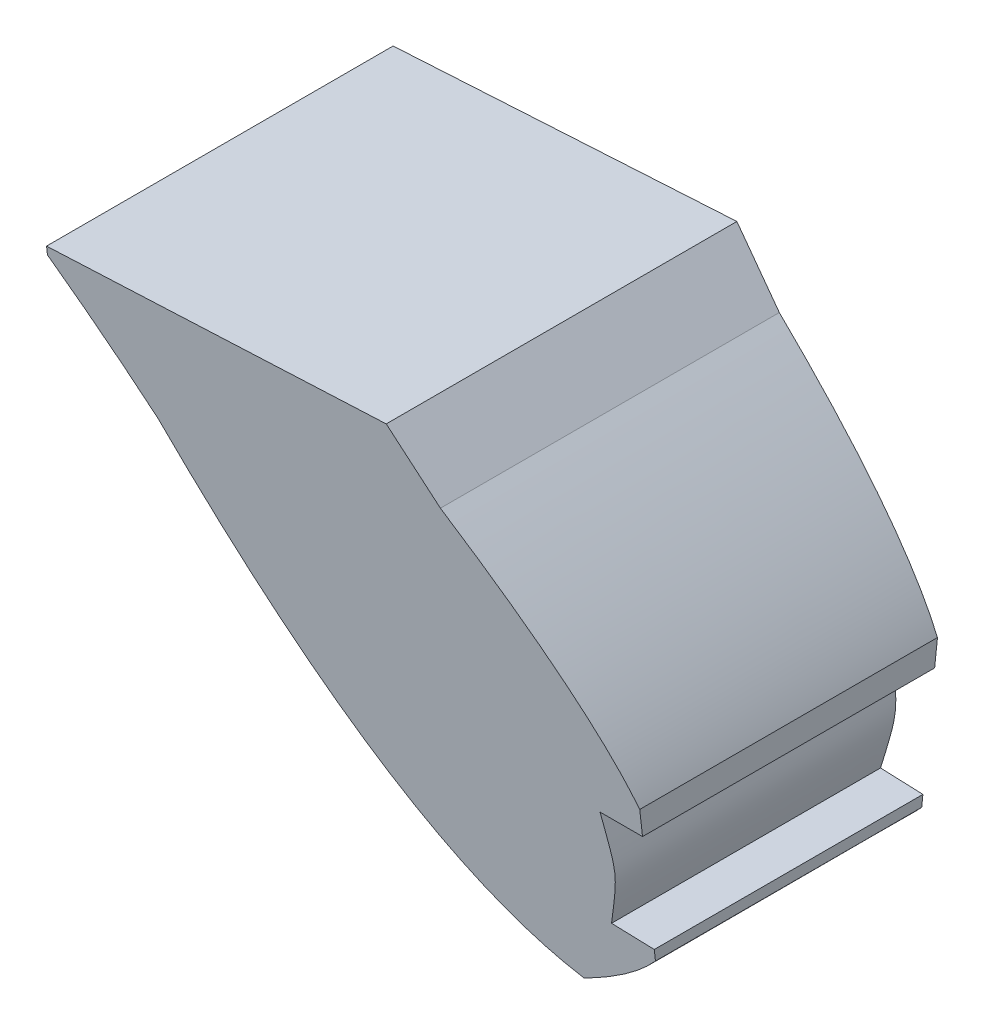
ISO-10303-21;
HEADER;
FILE_DESCRIPTION(('STEP AP214'),'2;1');
FILE_NAME('part.step','',(''),(''),'','','');
FILE_SCHEMA(('AUTOMOTIVE_DESIGN { 1 0 10303 214 1 1 1 1 }'));
ENDSEC;
DATA;
#1=APPLICATION_CONTEXT('core data for automotive mechanical design processes');
#2=APPLICATION_PROTOCOL_DEFINITION('international standard','automotive_design',2000,#1);
#3=PRODUCT_CONTEXT('',#1,'mechanical');
#4=PRODUCT('Part','Part','',(#3));
#5=PRODUCT_RELATED_PRODUCT_CATEGORY('part','',(#4));
#6=PRODUCT_DEFINITION_FORMATION('','',#4);
#7=PRODUCT_DEFINITION_CONTEXT('part definition',#1,'design');
#8=PRODUCT_DEFINITION('design','',#6,#7);
#9=PRODUCT_DEFINITION_SHAPE('','',#8);
#10=(LENGTH_UNIT() NAMED_UNIT(*) SI_UNIT(.MILLI.,.METRE.));
#11=(NAMED_UNIT(*) PLANE_ANGLE_UNIT() SI_UNIT($,.RADIAN.));
#12=(NAMED_UNIT(*) SI_UNIT($,.STERADIAN.) SOLID_ANGLE_UNIT());
#13=UNCERTAINTY_MEASURE_WITH_UNIT(LENGTH_MEASURE(1.E-05),#10,'distance_accuracy_value','');
#14=(GEOMETRIC_REPRESENTATION_CONTEXT(3) GLOBAL_UNCERTAINTY_ASSIGNED_CONTEXT((#13)) GLOBAL_UNIT_ASSIGNED_CONTEXT((#10,
#11,#12)) REPRESENTATION_CONTEXT('',''));
#15=CARTESIAN_POINT('',(0.,0.,0.));
#16=DIRECTION('',(0.,0.,1.));
#17=DIRECTION('',(1.,0.,0.));
#18=AXIS2_PLACEMENT_3D('',#15,#16,#17);
#19=CARTESIAN_POINT('',(0.355125000055651,-1.23774703808888E-13,7.21));
#20=DIRECTION('',(-1.,3.48538412642003E-13,0.));
#21=DIRECTION('',(-3.48538412642003E-13,-1.,0.));
#22=AXIS2_PLACEMENT_3D('',#19,#20,#21);
#23=PLANE('',#22);
#24=DIRECTION('',(0.,-0.993653373689782,0.112485434412263));
#25=VECTOR('',#24,1.);
#26=CARTESIAN_POINT('',(0.355125000056697,12.6081551722012,-7.21));
#27=LINE('',#26,#25);
#28=CARTESIAN_POINT('',(0.355125000056697,3.0015495286345,-6.12249480185305));
#29=VERTEX_POINT('',#28);
#30=CARTESIAN_POINT('',(0.355125000056447,1.97626956518499,-6.00642911422341));
#31=VERTEX_POINT('',#30);
#32=EDGE_CURVE('E58',#29,#31,#27,.T.);
#33=ORIENTED_EDGE('',*,*,#32,.F.);
#34=DIRECTION('',(0.,0.,-1.));
#35=VECTOR('',#34,1.);
#36=CARTESIAN_POINT('',(0.355125000056697,3.0015495286345,7.21));
#37=LINE('',#36,#35);
#38=CARTESIAN_POINT('',(0.355125000056697,3.0015495286345,6.12249480185305));
#39=VERTEX_POINT('',#38);
#40=EDGE_CURVE('E177',#39,#29,#37,.T.);
#41=ORIENTED_EDGE('',*,*,#40,.F.);
#42=DIRECTION('',(0.,0.993653373689782,0.112485434412263));
#43=VECTOR('',#42,1.);
#44=CARTESIAN_POINT('',(0.355125000056697,12.6081551722012,7.21));
#45=LINE('',#44,#43);
#46=CARTESIAN_POINT('',(0.355125000056697,1.97626956518499,6.00642911422342));
#47=VERTEX_POINT('',#46);
#48=EDGE_CURVE('E151',#47,#39,#45,.T.);
#49=ORIENTED_EDGE('',*,*,#48,.F.);
#50=DIRECTION('',(0.,0.,-1.));
#51=VECTOR('',#50,1.);
#52=CARTESIAN_POINT('',(0.355125000056447,1.97626956518499,7.21));
#53=LINE('',#52,#51);
#54=EDGE_CURVE('E171',#47,#31,#53,.T.);
#55=ORIENTED_EDGE('',*,*,#54,.T.);
#56=EDGE_LOOP('',(#33,#41,#49,#55));
#57=FACE_BOUND('',#56,.T.);
#58=ADVANCED_FACE('F43',(#57),#23,.F.);
#59=CARTESIAN_POINT('',(-23.0359211456035,0.,7.21));
#60=DIRECTION('',(-1.,0.,0.));
#61=DIRECTION('',(0.,0.,1.));
#62=AXIS2_PLACEMENT_3D('',#59,#60,#61);
#63=PLANE('',#62);
#64=DIRECTION('',(0.,0.,-1.));
#65=VECTOR('',#64,1.);
#66=CARTESIAN_POINT('',(-23.0359211456035,11.8716122879342,7.21));
#67=LINE('',#66,#65);
#68=CARTESIAN_POINT('',(-23.0359211456035,11.8716122879342,7.12662047501294));
#69=VERTEX_POINT('',#68);
#70=CARTESIAN_POINT('',(-23.0359211456035,11.8716122879342,-7.12662047501294));
#71=VERTEX_POINT('',#70);
#72=EDGE_CURVE('E188',#69,#71,#67,.T.);
#73=ORIENTED_EDGE('',*,*,#72,.T.);
#74=DIRECTION('',(0.,-0.993653373689782,0.112485434412263));
#75=VECTOR('',#74,1.);
#76=CARTESIAN_POINT('',(-23.0359211456035,12.6081551722012,-7.21));
#77=LINE('',#76,#75);
#78=CARTESIAN_POINT('',(-23.0359211456035,11.5401378200982,-7.08909627341673));
#79=VERTEX_POINT('',#78);
#80=EDGE_CURVE('E324',#71,#79,#77,.T.);
#81=ORIENTED_EDGE('',*,*,#80,.T.);
#82=DIRECTION('',(0.,0.,-1.));
#83=VECTOR('',#82,1.);
#84=CARTESIAN_POINT('',(-23.0359211456035,11.5401378200983,7.21));
#85=LINE('',#84,#83);
#86=CARTESIAN_POINT('',(-23.0359211456035,11.5401378200982,7.08909627341673));
#87=VERTEX_POINT('',#86);
#88=EDGE_CURVE('E195',#87,#79,#85,.T.);
#89=ORIENTED_EDGE('',*,*,#88,.F.);
#90=DIRECTION('',(0.,0.993653373689782,0.112485434412263));
#91=VECTOR('',#90,1.);
#92=CARTESIAN_POINT('',(-23.0359211456035,12.6081551722012,7.21));
#93=LINE('',#92,#91);
#94=EDGE_CURVE('E316',#87,#69,#93,.T.);
#95=ORIENTED_EDGE('',*,*,#94,.T.);
#96=EDGE_LOOP('',(#73,#81,#89,#95));
#97=FACE_BOUND('',#96,.T.);
#98=ADVANCED_FACE('F319',(#97),#63,.T.);
#99=CARTESIAN_POINT('',(-18.9451921135982,7.54091889574655,7.21));
#100=CARTESIAN_POINT('',(-10.2150083842792,-3.69764410322756,7.21));
#101=CARTESIAN_POINT('',(-2.84660482498738,-5.05908110388432,7.21));
#102=(BOUNDED_CURVE() B_SPLINE_CURVE(2,(#99,#100,#101),.UNSPECIFIED.,.F.,
.F.) B_SPLINE_CURVE_WITH_KNOTS((3,3),(0.497667241108509,0.499554279588011),
.UNSPECIFIED.) CURVE() GEOMETRIC_REPRESENTATION_ITEM() RATIONAL_B_SPLINE_CURVE((1.,1.,1.)) REPRESENTATION_ITEM(''));
#103=DIRECTION('',(0.,0.,-1.));
#104=VECTOR('',#103,1.);
#105=SURFACE_OF_LINEAR_EXTRUSION('',#102,#104);
#106=DIRECTION('',(0.,0.,-1.));
#107=VECTOR('',#106,1.);
#108=CARTESIAN_POINT('',(-18.9451921135982,7.54091889574657,7.21));
#109=LINE('',#108,#107);
#110=CARTESIAN_POINT('',(-18.9451921135982,7.54091889574657,6.63636910524442));
#111=VERTEX_POINT('',#110);
#112=CARTESIAN_POINT('',(-18.9451921135982,7.54091889574657,-6.63636910524442));
#113=VERTEX_POINT('',#112);
#114=EDGE_CURVE('E198',#111,#113,#109,.T.);
#115=ORIENTED_EDGE('',*,*,#114,.T.);
#116=CARTESIAN_POINT('',(-18.9451921135982,7.54091889574655,-6.63636910524441));
#117=CARTESIAN_POINT('',(-18.7033608655423,7.22962108931645,-6.60112898035273));
#118=CARTESIAN_POINT('',(-18.4592647140916,6.9200497206851,-6.56608429494821));
#119=CARTESIAN_POINT('',(-17.9661198805234,6.30464603742845,-6.49641819962467));
#120=CARTESIAN_POINT('',(-17.7170694462669,5.99881510969872,-6.46179694670763));
#121=CARTESIAN_POINT('',(-17.2137366178937,5.3913665824337,-6.39303140604553));
#122=CARTESIAN_POINT('',(-16.9594535947769,5.08974949683998,-6.35888717648066));
#123=CARTESIAN_POINT('',(-16.4451285665965,4.49103725761873,-6.29111061767257));
#124=CARTESIAN_POINT('',(-16.1850826962375,4.19394537928884,-6.25747865920581));
#125=CARTESIAN_POINT('',(-15.6590118901181,3.60508061675355,-6.1908168731366));
#126=CARTESIAN_POINT('',(-15.3929875534481,3.31330720485499,-6.15778698579723));
#127=CARTESIAN_POINT('',(-14.8544901847056,2.7357195544677,-6.09240181277284));
#128=CARTESIAN_POINT('',(-14.5820174931064,2.44990500284308,-6.06004649163962));
#129=CARTESIAN_POINT('',(-13.9777704357619,1.83142011947111,-5.99003159245484));
#130=CARTESIAN_POINT('',(-13.6445482479649,1.50014167377654,-5.95252958132897));
#131=CARTESIAN_POINT('',(-12.9673134934436,0.848664446736888,-5.87877982026175));
#132=CARTESIAN_POINT('',(-12.623301443116,0.528465136688492,-5.84253201046914));
#133=CARTESIAN_POINT('',(-11.9227759490938,-0.0995013958587514,-5.7714437516454));
#134=CARTESIAN_POINT('',(-11.5662405708663,-0.407244542107335,-5.73660602813964));
#135=CARTESIAN_POINT('',(-10.840142749037,-1.00720368374379,-5.66868831511867));
#136=CARTESIAN_POINT('',(-10.4705807273197,-1.29942018121482,-5.6356082687657));
#137=CARTESIAN_POINT('',(-9.71382699072171,-1.86779135556405,-5.57126643674768));
#138=CARTESIAN_POINT('',(-9.32650636654571,-2.14377746328672,-5.540023733768));
#139=CARTESIAN_POINT('',(-8.5360986768139,-2.67282289543975,-5.48013372902864));
#140=CARTESIAN_POINT('',(-8.13300835344273,-2.92587744631612,-5.45148696765387));
#141=CARTESIAN_POINT('',(-7.31201826568453,-3.40280761684766,-5.39749661363601));
#142=CARTESIAN_POINT('',(-6.89419365451789,-3.62680992502778,-5.37213867935817));
#143=CARTESIAN_POINT('',(-6.04187322097519,-4.0405536088069,-5.32530128189388));
#144=CARTESIAN_POINT('',(-5.60738935372736,-4.23031901573022,-5.30381909826786));
#145=CARTESIAN_POINT('',(-4.78985442909107,-4.54236533838515,-5.26849423842238));
#146=CARTESIAN_POINT('',(-4.4091055725695,-4.67052923075731,-5.25398558631979));
#147=CARTESIAN_POINT('',(-3.82960691198316,-4.83674345690554,-5.23516948814227));
#148=CARTESIAN_POINT('',(-3.63462104960687,-4.8878904691115,-5.22937944702812));
#149=CARTESIAN_POINT('',(-3.24229120544362,-4.9807402777546,-5.21886848683127));
#150=CARTESIAN_POINT('',(-3.0449461414238,-5.02243854990591,-5.21414807991536));
#151=CARTESIAN_POINT('',(-2.84660482498738,-5.05908110388432,-5.21));
#152=B_SPLINE_CURVE_WITH_KNOTS('',3,(#116,#117,#118,#119,#120,#121,#122,#123,#124,#125,#126,
#127,#128,#129,#130,#131,#132,#133,#134,#135,#136,#137,#138,#139,#140,#141,#142,#143,#144,#145,
#146,#147,#148,#149,#150,#151),.UNSPECIFIED.,.F.,.F.,(4,2,2,2,2,2,2,2,2,2,2,2,2,2,2,2,2,4),(0.,
1.1872997216569,2.37502708567824,3.56289806807204,4.75159146291787,5.9401662676152,
7.12867845491363,8.54255640265696,9.95636678593971,11.3727907462706,12.7891688759803,
14.2183172044781,15.6477623519031,17.0707480146133,18.4927309460623,19.6971402338765,
20.3019233237111,20.9069953892921),.UNSPECIFIED.);
#153=CARTESIAN_POINT('',(-2.84660482498738,-5.05908110388432,-5.21));
#154=VERTEX_POINT('',#153);
#155=EDGE_CURVE('E259',#113,#154,#152,.T.);
#156=ORIENTED_EDGE('',*,*,#155,.T.);
#157=DIRECTION('',(0.,0.,-1.));
#158=VECTOR('',#157,1.);
#159=CARTESIAN_POINT('',(-2.84660482498738,-5.05908110388432,7.21));
#160=LINE('',#159,#158);
#161=CARTESIAN_POINT('',(-2.84660482498738,-5.05908110388432,5.21));
#162=VERTEX_POINT('',#161);
#163=EDGE_CURVE('E160',#162,#154,#160,.T.);
#164=ORIENTED_EDGE('',*,*,#163,.F.);
#165=CARTESIAN_POINT('',(-2.84660482498738,-5.05908110388432,5.21));
#166=CARTESIAN_POINT('',(-3.0836355452615,-5.01529762547054,5.21495646039138));
#167=CARTESIAN_POINT('',(-3.31925014057108,-4.96428184629726,5.22073164541478));
#168=CARTESIAN_POINT('',(-3.78628189704186,-4.84911384389608,5.23376911212451));
#169=CARTESIAN_POINT('',(-4.01771143135529,-4.78501130060695,5.24102576984815));
#170=CARTESIAN_POINT('',(-4.47638324853452,-4.64477679089168,5.25690086287615));
#171=CARTESIAN_POINT('',(-4.70363211310206,-4.56866593727755,5.26551690812791));
#172=CARTESIAN_POINT('',(-5.1539801611568,-4.40545252874729,5.28399330205617));
#173=CARTESIAN_POINT('',(-5.37708095327682,-4.31835434125152,5.29385315632366));
#174=CARTESIAN_POINT('',(-5.81545834234536,-4.13567110279715,5.31453361087802));
#175=CARTESIAN_POINT('',(-6.03080317783365,-4.04024711994086,5.32533597762798));
#176=CARTESIAN_POINT('',(-6.45748946905634,-3.84057736608456,5.34793937192645));
#177=CARTESIAN_POINT('',(-6.66882789943329,-3.73632522989765,5.35974112003892));
#178=CARTESIAN_POINT('',(-7.08747417766979,-3.51983158147829,5.38424904476877));
#179=CARTESIAN_POINT('',(-7.29477947597257,-3.40758521204135,5.39695577124062));
#180=CARTESIAN_POINT('',(-7.70530843131035,-3.17590609220346,5.42318275051655));
#181=CARTESIAN_POINT('',(-7.90853147430462,-3.0564722713248,5.43670312450288));
#182=CARTESIAN_POINT('',(-8.45410340689061,-2.72385368196738,5.47435684511425));
#183=CARTESIAN_POINT('',(-8.79259906035209,-2.50440768840731,5.49919898682003));
#184=CARTESIAN_POINT('',(-9.45845448583479,-2.04949644973372,5.5506967119384));
#185=CARTESIAN_POINT('',(-9.78581359629267,-1.81403025542841,5.5773524028032));
#186=CARTESIAN_POINT('',(-10.4302582396863,-1.32938575303013,5.63221604925302));
#187=CARTESIAN_POINT('',(-10.7473396395034,-1.08020203459831,5.66042461730948));
#188=CARTESIAN_POINT('',(-11.3718438106499,-0.570176876647104,5.71816145288252));
#189=CARTESIAN_POINT('',(-11.6792662750814,-0.309335067346119,5.74768976225981));
#190=CARTESIAN_POINT('',(-12.2887351366992,0.225514030316342,5.80823676455314));
#191=CARTESIAN_POINT('',(-12.5906756597182,0.499640146613562,5.83926890925461));
#192=CARTESIAN_POINT('',(-13.1859914625247,1.05668157973797,5.90232817041119));
#193=CARTESIAN_POINT('',(-13.4793699933214,1.33959347409339,5.93435489942917));
#194=CARTESIAN_POINT('',(-14.0582984741035,1.91313890151101,5.99928247705986));
#195=CARTESIAN_POINT('',(-14.3438493181123,2.20377154523463,6.03218322499598));
#196=CARTESIAN_POINT('',(-14.9077244427009,2.7918210558895,6.09875272137508));
#197=CARTESIAN_POINT('',(-15.1860493084316,3.08923736980037,6.13242140721399));
#198=CARTESIAN_POINT('',(-15.7683607406539,3.72540309630891,6.20443784674841));
#199=CARTESIAN_POINT('',(-16.0715178451228,4.06490144250158,6.24287038264565));
#200=CARTESIAN_POINT('',(-16.6701836985208,4.7504922746204,6.32048193675692));
#201=CARTESIAN_POINT('',(-16.9656923307507,5.09658486102068,6.35966096634501));
#202=CARTESIAN_POINT('',(-17.4495199616275,5.67490501691598,6.42512906184765));
#203=CARTESIAN_POINT('',(-17.6398456690967,5.90547984199544,6.45123103065322));
#204=CARTESIAN_POINT('',(-18.0176052393411,6.36895711711416,6.50369846448112));
#205=CARTESIAN_POINT('',(-18.205039097963,6.60185957049552,6.5300639298818));
#206=CARTESIAN_POINT('',(-18.5771476687389,7.06981539005112,6.58303835239394));
#207=CARTESIAN_POINT('',(-18.7618224957771,7.30486866600559,6.60964729929217));
#208=CARTESIAN_POINT('',(-18.9451921135982,7.54091889574655,6.63636910524441));
#209=B_SPLINE_CURVE_WITH_KNOTS('',3,(#165,#166,#167,#168,#169,#170,#171,#172,#173,#174,#175,
#176,#177,#178,#179,#180,#181,#182,#183,#184,#185,#186,#187,#188,#189,#190,#191,#192,#193,#194,
#195,#196,#197,#198,#199,#200,#201,#202,#203,#204,#205,#206,#207,#208),.UNSPECIFIED.,.F.,.F.,(4,
2,2,2,2,2,2,2,2,2,2,2,2,2,2,2,2,2,2,2,2,4),(0.,0.723070627629283,1.44344574109941,
2.16256813451498,2.88140557514503,3.58855192345824,4.2962125448096,5.0043068623572,
5.71250690363926,6.92441762508089,8.13640021448464,9.3488642962315,10.5613668633146,
11.788141520998,13.0144441434254,14.2406061176645,15.4666684871313,16.8368576095009,
18.2070676256843,19.1073954524656,20.0077245721621,20.9080160976373),.UNSPECIFIED.);
#210=EDGE_CURVE('E140',#162,#111,#209,.T.);
#211=ORIENTED_EDGE('',*,*,#210,.T.);
#212=EDGE_LOOP('',(#115,#156,#164,#211));
#213=FACE_BOUND('',#212,.T.);
#214=ADVANCED_FACE('F44',(#213),#105,.F.);
#215=CARTESIAN_POINT('',(-2.84660482498738,-5.05908110388432,7.21));
#216=CARTESIAN_POINT('',(-0.742366881974002,-3.93520659958673,7.21));
#217=CARTESIAN_POINT('',(0.355124999965198,-2.72325322699678,7.21));
#218=(BOUNDED_CURVE() B_SPLINE_CURVE(2,(#215,#216,#217),.UNSPECIFIED.,.F.,
.F.) B_SPLINE_CURVE_WITH_KNOTS((3,3),(0.498812074629495,0.499412845463797),
.UNSPECIFIED.) CURVE() GEOMETRIC_REPRESENTATION_ITEM() RATIONAL_B_SPLINE_CURVE((1.,1.,1.)) REPRESENTATION_ITEM(''));
#219=DIRECTION('',(0.,0.,-1.));
#220=VECTOR('',#219,1.);
#221=SURFACE_OF_LINEAR_EXTRUSION('',#218,#220);
#222=ORIENTED_EDGE('',*,*,#163,.T.);
#223=CARTESIAN_POINT('',(-2.84660482498738,-5.05908110388432,-5.21));
#224=CARTESIAN_POINT('',(-2.67154367534484,-4.96554243060771,-5.22058894235803));
#225=CARTESIAN_POINT('',(-2.49778385523126,-4.86952307483158,-5.23145870764283));
#226=CARTESIAN_POINT('',(-2.15332890723938,-4.67164155861341,-5.25385966647147));
#227=CARTESIAN_POINT('',(-1.9826387176766,-4.56977092703724,-5.26539181898071));
#228=CARTESIAN_POINT('',(-1.64527137465746,-4.35955519460265,-5.2891890591545));
#229=CARTESIAN_POINT('',(-1.47859514121983,-4.25120862887406,-5.30145431264808));
#230=CARTESIAN_POINT('',(-1.15044448784201,-4.02724001195876,-5.32680843294344));
#231=CARTESIAN_POINT('',(-0.98896568487432,-3.911624347545,-5.33989657673763));
#232=CARTESIAN_POINT('',(-0.724614348138144,-3.7114805449727,-5.36255363519824));
#233=CARTESIAN_POINT('',(-0.619967455079453,-3.6292658395869,-5.37186066025876));
#234=CARTESIAN_POINT('',(-0.414118763296717,-3.46070156785231,-5.39094279275538));
#235=CARTESIAN_POINT('',(-0.312916415666604,-3.3743526656372,-5.40071782500895));
#236=CARTESIAN_POINT('',(-0.114288127047668,-3.19685300163986,-5.42081147873311));
#237=CARTESIAN_POINT('',(-0.0168745915935634,-3.10568844995875,-5.431131661274));
#238=CARTESIAN_POINT('',(0.173044677325633,-2.91833195578561,-5.45234114658855));
#239=CARTESIAN_POINT('',(0.265547074526193,-2.82213668167119,-5.46323082651485));
#240=CARTESIAN_POINT('',(0.355124999965198,-2.72325322699678,-5.47442481895704));
#241=B_SPLINE_CURVE_WITH_KNOTS('',3,(#223,#224,#225,#226,#227,#228,#229,#230,#231,#232,#233,
#234,#235,#236,#237,#238,#239,#240),.UNSPECIFIED.,.F.,.F.,(4,2,2,2,2,2,2,2,4),(0.,
0.596333361221147,1.19355295493407,1.79090815604603,2.38774565156578,2.78786762990545,
3.18792554534165,3.58919872466333,3.99074110013676),.UNSPECIFIED.);
#242=CARTESIAN_POINT('',(0.355125000010947,-2.72325322699678,-5.47442481895703));
#243=VERTEX_POINT('',#242);
#244=EDGE_CURVE('E156',#154,#243,#241,.T.);
#245=ORIENTED_EDGE('',*,*,#244,.T.);
#246=DIRECTION('',(0.,0.,-1.));
#247=VECTOR('',#246,1.);
#248=CARTESIAN_POINT('',(0.355124999965198,-2.72325322699678,7.21));
#249=LINE('',#248,#247);
#250=CARTESIAN_POINT('',(0.355125000010947,-2.72325322699678,5.47442481895703));
#251=VERTEX_POINT('',#250);
#252=EDGE_CURVE('E148',#251,#243,#249,.T.);
#253=ORIENTED_EDGE('',*,*,#252,.F.);
#254=CARTESIAN_POINT('',(0.355124999965198,-2.72325322699678,5.47442481895703));
#255=CARTESIAN_POINT('',(0.288265800066398,-2.79707578870119,5.46606781726749));
#256=CARTESIAN_POINT('',(0.219762299322532,-2.86939557158838,5.45788093599675));
#257=CARTESIAN_POINT('',(0.0798741499126208,-3.0111837154317,5.44182996553056));
#258=CARTESIAN_POINT('',(0.00849051694650479,-3.08065306448068,5.43396576447915));
#259=CARTESIAN_POINT('',(-0.209110404202349,-3.28478130911614,5.41085765164865));
#260=CARTESIAN_POINT('',(-0.359086186155244,-3.41549544786354,5.39606030171743));
#261=CARTESIAN_POINT('',(-0.666431647279958,-3.66745151891472,5.36753789253992));
#262=CARTESIAN_POINT('',(-0.823790135326829,-3.78870709059741,5.35381128926277));
#263=CARTESIAN_POINT('',(-1.14463764434189,-4.02329424679429,5.32725510893767));
#264=CARTESIAN_POINT('',(-1.30813354467851,-4.13661650521983,5.31442658763929));
#265=CARTESIAN_POINT('',(-1.58497175174893,-4.31986712055689,5.29368190381061));
#266=CARTESIAN_POINT('',(-1.69701528140079,-4.39175032218513,5.28554444523986));
#267=CARTESIAN_POINT('',(-1.92294333828473,-4.53261962763427,5.26959749086083));
#268=CARTESIAN_POINT('',(-2.03682799400811,-4.6016055280346,5.26178801808056));
#269=CARTESIAN_POINT('',(-2.26591352019373,-4.73675126913538,5.24648899349189));
#270=CARTESIAN_POINT('',(-2.38111062922232,-4.80291742324192,5.23899872698133));
#271=CARTESIAN_POINT('',(-2.6128736149529,-4.93278949726635,5.22429670205848));
#272=CARTESIAN_POINT('',(-2.72943923096306,-4.99649587614853,5.21708489168965));
#273=CARTESIAN_POINT('',(-2.84660482498738,-5.05908110388432,5.21));
#274=B_SPLINE_CURVE_WITH_KNOTS('',3,(#254,#255,#256,#257,#258,#259,#260,#261,#262,#263,#264,
#265,#266,#267,#268,#269,#270,#271,#272,#273),.UNSPECIFIED.,.F.,.F.,(4,2,2,2,2,2,2,2,2,4),(0.,
0.299782926841572,0.599461041577767,1.1974499434567,1.79455995327913,2.39236050766276,
2.79242459253001,3.19251671924541,3.59166012626068,3.99072869445439),.UNSPECIFIED.);
#275=EDGE_CURVE('E133',#251,#162,#274,.T.);
#276=ORIENTED_EDGE('',*,*,#275,.T.);
#277=EDGE_LOOP('',(#222,#245,#253,#276));
#278=FACE_BOUND('',#277,.T.);
#279=ADVANCED_FACE('F159',(#278),#221,.F.);
#280=CARTESIAN_POINT('',(0.355125000532009,-7.39148800447813E-11,7.21));
#281=DIRECTION('',(1.,-2.08137641489758E-10,0.));
#282=DIRECTION('',(2.08137641489758E-10,1.,0.));
#283=AXIS2_PLACEMENT_3D('',#280,#281,#282);
#284=PLANE('',#283);
#285=CARTESIAN_POINT('',(0.355125000056697,-2.28484178142546,-5.52405470319249));
#286=VERTEX_POINT('',#285);
#287=EDGE_CURVE('E155',#286,#243,#27,.T.);
#288=ORIENTED_EDGE('',*,*,#287,.F.);
#289=DIRECTION('',(0.,0.,-1.));
#290=VECTOR('',#289,1.);
#291=CARTESIAN_POINT('',(0.355125000056447,-2.28484178142545,7.21));
#292=LINE('',#291,#290);
#293=CARTESIAN_POINT('',(0.355125000056697,-2.28484178142546,5.52405470319249));
#294=VERTEX_POINT('',#293);
#295=EDGE_CURVE('E153',#294,#286,#292,.T.);
#296=ORIENTED_EDGE('',*,*,#295,.F.);
#297=EDGE_CURVE('E132',#251,#294,#45,.T.);
#298=ORIENTED_EDGE('',*,*,#297,.F.);
#299=ORIENTED_EDGE('',*,*,#252,.T.);
#300=EDGE_LOOP('',(#288,#296,#298,#299));
#301=FACE_BOUND('',#300,.T.);
#302=ADVANCED_FACE('F150',(#301),#284,.T.);
#303=CARTESIAN_POINT('',(-0.0792587195419091,-2.26967276768239,7.21));
#304=DIRECTION('',(-0.0348994967024901,-0.999390827019096,0.));
#305=DIRECTION('',(0.999390827019096,-0.0348994967024901,0.));
#306=AXIS2_PLACEMENT_3D('',#303,#304,#305);
#307=PLANE('',#306);
#308=ORIENTED_EDGE('',*,*,#295,.T.);
#309=DIRECTION('',(-0.999383027616045,0.034899224341334,-0.00395072820626436));
#310=VECTOR('',#309,1.);
#311=CARTESIAN_POINT('',(-0.0289741896082848,-2.2714287421612,-5.52557311151111));
#312=LINE('',#311,#310);
#313=CARTESIAN_POINT('',(-1.39487499994356,-2.22373043481491,-5.5309727457947));
#314=VERTEX_POINT('',#313);
#315=EDGE_CURVE('E305',#286,#314,#312,.T.);
#316=ORIENTED_EDGE('',*,*,#315,.T.);
#317=DIRECTION('',(0.,0.,-1.));
#318=VECTOR('',#317,1.);
#319=CARTESIAN_POINT('',(-1.39487499994356,-2.22373043481491,7.21));
#320=LINE('',#319,#318);
#321=CARTESIAN_POINT('',(-1.39487499994356,-2.22373043481491,5.5309727457947));
#322=VERTEX_POINT('',#321);
#323=EDGE_CURVE('E163',#322,#314,#320,.T.);
#324=ORIENTED_EDGE('',*,*,#323,.F.);
#325=DIRECTION('',(0.999383027616045,-0.034899224341334,-0.00395072820626436));
#326=VECTOR('',#325,1.);
#327=CARTESIAN_POINT('',(-0.0859085417339361,-2.26944055077446,5.52579818252456));
#328=LINE('',#327,#326);
#329=EDGE_CURVE('E323',#322,#294,#328,.T.);
#330=ORIENTED_EDGE('',*,*,#329,.T.);
#331=EDGE_LOOP('',(#308,#316,#324,#330));
#332=FACE_BOUND('',#331,.T.);
#333=ADVANCED_FACE('F334',(#332),#307,.F.);
#334=CARTESIAN_POINT('',(-1.39487499994356,-2.22373043481491,7.21));
#335=CARTESIAN_POINT('',(-0.907530669798052,-0.123730434814926,7.21));
#336=CARTESIAN_POINT('',(-1.39487499994356,1.976269565185,7.21));
#337=(BOUNDED_CURVE() B_SPLINE_CURVE(2,(#334,#335,#336),.UNSPECIFIED.,.F.,
.F.) B_SPLINE_CURVE_WITH_KNOTS((3,3),(0.,1.),
.UNSPECIFIED.) CURVE() GEOMETRIC_REPRESENTATION_ITEM() RATIONAL_B_SPLINE_CURVE((1.,
3.23180121851367,1.)) REPRESENTATION_ITEM(''));
#338=DIRECTION('',(0.,0.,-1.));
#339=VECTOR('',#338,1.);
#340=SURFACE_OF_LINEAR_EXTRUSION('',#337,#339);
#341=ORIENTED_EDGE('',*,*,#323,.T.);
#342=CARTESIAN_POINT('',(-1.39487499994356,-2.22373043481491,-5.5309727457947));
#343=CARTESIAN_POINT('',(-1.38202447122813,-2.16835021356968,-5.53724200266994));
#344=CARTESIAN_POINT('',(-1.36921744547373,-2.11295996104296,-5.54351239512535));
#345=CARTESIAN_POINT('',(-1.34371955909939,-2.00215267308472,-5.55605621196536));
#346=CARTESIAN_POINT('',(-1.33102869927897,-1.94673563747162,-5.56232963637053));
#347=CARTESIAN_POINT('',(-1.30579250980865,-1.83586894873068,-5.57488017761064));
#348=CARTESIAN_POINT('',(-1.29324717983284,-1.78041929567618,-5.58115729443729));
#349=CARTESIAN_POINT('',(-1.26834035470031,-1.66945670178657,-5.593718692514));
#350=CARTESIAN_POINT('',(-1.25597893242913,-1.61394374477822,-5.60000297559494));
#351=CARTESIAN_POINT('',(-1.23150428056634,-1.50286329328951,-5.61257771561119));
#352=CARTESIAN_POINT('',(-1.21939105277074,-1.44729579841754,-5.61886817259083));
#353=CARTESIAN_POINT('',(-1.19550012207595,-1.33608743052918,-5.63145739324204));
#354=CARTESIAN_POINT('',(-1.1837224309966,-1.2804465549999,-5.63775615719808));
#355=CARTESIAN_POINT('',(-1.15485704104805,-1.14125615214793,-5.65351305326002));
#356=CARTESIAN_POINT('',(-1.13805530724695,-1.05764770999797,-5.66297785475397));
#357=CARTESIAN_POINT('',(-1.10616760722362,-0.890046794372652,-5.68195093158457));
#358=CARTESIAN_POINT('',(-1.09108267359643,-0.806054121054038,-5.69145922954426));
#359=CARTESIAN_POINT('',(-1.06839764881353,-0.664871544058104,-5.70744164748328));
#360=CARTESIAN_POINT('',(-1.05995626751594,-0.607817685780514,-5.71390036659317));
#361=CARTESIAN_POINT('',(-1.04516806244473,-0.493450404650502,-5.72684718853439));
#362=CARTESIAN_POINT('',(-1.03882061818002,-0.436137063802354,-5.73333528208253));
#363=CARTESIAN_POINT('',(-1.02903068414648,-0.32130807468907,-5.74633437116685));
#364=CARTESIAN_POINT('',(-1.02558541499307,-0.263792673078832,-5.75284533878074));
#365=CARTESIAN_POINT('',(-1.02222407231355,-0.148714957691158,-5.76587258464866));
#366=CARTESIAN_POINT('',(-1.02230420900467,-0.0911527608046728,-5.77238884967019));
#367=CARTESIAN_POINT('',(-1.02596900528622,0.0239015023985969,-5.78541344065945));
#368=CARTESIAN_POINT('',(-1.02955657044098,0.0813934710005598,-5.79192175556548));
#369=CARTESIAN_POINT('',(-1.03959132289802,0.19613338530381,-5.80491076103415));
#370=CARTESIAN_POINT('',(-1.04603929917214,0.253381259276289,-5.81139144347682));
#371=CARTESIAN_POINT('',(-1.05997220439613,0.35983137212623,-5.8234420111136));
#372=CARTESIAN_POINT('',(-1.06719667195452,0.409068491171902,-5.82901584487869));
#373=CARTESIAN_POINT('',(-1.08274764683563,0.507347946837772,-5.84014146227917));
#374=CARTESIAN_POINT('',(-1.0910737056158,0.556390354412903,-5.84569325394695));
#375=CARTESIAN_POINT('',(-1.10853037258208,0.654424381213792,-5.85679108784343));
#376=CARTESIAN_POINT('',(-1.11766242226862,0.70341574413319,-5.86233710105724));
#377=CARTESIAN_POINT('',(-1.1364977866421,0.801294033672846,-5.8734173048888));
#378=CARTESIAN_POINT('',(-1.14620115522269,0.850180949988233,-5.87895149433999));
#379=CARTESIAN_POINT('',(-1.16833495400599,0.959258362431623,-5.89129948252998));
#380=CARTESIAN_POINT('',(-1.1808737668477,1.01942705832357,-5.89811081339709));
#381=CARTESIAN_POINT('',(-1.20639174214038,1.13967062360228,-5.91172285360526));
#382=CARTESIAN_POINT('',(-1.21937089694786,1.19974549459873,-5.91852356312855));
#383=CARTESIAN_POINT('',(-1.24564626429316,1.31982703510014,-5.93211726150049));
#384=CARTESIAN_POINT('',(-1.2589424791072,1.37983370411223,-5.93891025029334));
#385=CARTESIAN_POINT('',(-1.28569888355067,1.49948275843749,-5.95245498954463));
#386=CARTESIAN_POINT('',(-1.29915785770072,1.55912541262012,-5.95920677044014));
#387=CARTESIAN_POINT('',(-1.32625009614692,1.67837055204035,-5.97270578495002));
#388=CARTESIAN_POINT('',(-1.33988335761136,1.73797303791406,-5.97945301863641));
#389=CARTESIAN_POINT('',(-1.36728618039678,1.85714403003134,-5.99294363938264));
#390=CARTESIAN_POINT('',(-1.381055735056,1.91671253778666,-5.9996870266136));
#391=CARTESIAN_POINT('',(-1.39487499994356,1.976269565185,-6.00642911422342));
#392=B_SPLINE_CURVE_WITH_KNOTS('',3,(#342,#343,#344,#345,#346,#347,#348,#349,#350,#351,#352,
#353,#354,#355,#356,#357,#358,#359,#360,#361,#362,#363,#364,#365,#366,#367,#368,#369,#370,#371,
#372,#373,#374,#375,#376,#377,#378,#379,#380,#381,#382,#383,#384,#385,#386,#387,#388,#389,#390,
#391),.UNSPECIFIED.,.F.,.F.,(4,2,2,2,2,2,2,2,2,2,2,2,2,2,2,2,2,2,2,2,2,2,2,2,4),(0.,
0.171588763273453,0.343178706622211,0.514768265617105,0.686424107910212,0.858081191922479,
1.02974431538338,1.28714724145325,1.54470417716685,1.71878537631805,1.8928149439917,
2.06667765516018,2.24035346989174,2.41417328020677,2.58804106414591,2.73825198714263,
2.88840193486919,3.03882608638502,3.18926445051695,3.37477476712053,3.56028186526787,
3.74579029559563,3.93033206952695,4.11487084894101,4.29940065253389),.UNSPECIFIED.);
#393=CARTESIAN_POINT('',(-1.39487499994356,1.976269565185,-6.00642911422342));
#394=VERTEX_POINT('',#393);
#395=EDGE_CURVE('E178',#314,#394,#392,.T.);
#396=ORIENTED_EDGE('',*,*,#395,.T.);
#397=DIRECTION('',(0.,0.,-1.));
#398=VECTOR('',#397,1.);
#399=CARTESIAN_POINT('',(-1.39487499994356,1.976269565185,7.21));
#400=LINE('',#399,#398);
#401=CARTESIAN_POINT('',(-1.39487499994356,1.976269565185,6.00642911422342));
#402=VERTEX_POINT('',#401);
#403=EDGE_CURVE('E169',#402,#394,#400,.T.);
#404=ORIENTED_EDGE('',*,*,#403,.F.);
#405=CARTESIAN_POINT('',(-1.39487499994356,1.976269565185,6.00642911422342));
#406=CARTESIAN_POINT('',(-1.37907511533365,1.90817072448153,5.99872006005792));
#407=CARTESIAN_POINT('',(-1.36333836969219,1.84005724657732,5.99100934890426));
#408=CARTESIAN_POINT('',(-1.33204781411177,1.703774616767,5.97558162408294));
#409=CARTESIAN_POINT('',(-1.31649404111311,1.63560545649229,5.96786460946793));
#410=CARTESIAN_POINT('',(-1.28563112684324,1.49920642241426,5.95242370722985));
#411=CARTESIAN_POINT('',(-1.27032200601989,1.43097654403409,5.94469981908867));
#412=CARTESIAN_POINT('',(-1.2399275173513,1.29390485970128,5.92918277022027));
#413=CARTESIAN_POINT('',(-1.22484485449072,1.22506245970345,5.92138954224482));
#414=CARTESIAN_POINT('',(-1.19518112320204,1.0872751663326,5.90579148364441));
#415=CARTESIAN_POINT('',(-1.18060002365467,1.01833027959621,5.89798665377074));
#416=CARTESIAN_POINT('',(-1.1521828568661,0.880291295746957,5.88236010282727));
#417=CARTESIAN_POINT('',(-1.13834675067045,0.81119720663251,5.87453838266293));
#418=CARTESIAN_POINT('',(-1.11516473949854,0.690174385789182,5.86083812768789));
#419=CARTESIAN_POINT('',(-1.10556404533104,0.638294159941606,5.85496508393199));
#420=CARTESIAN_POINT('',(-1.08728934318226,0.534373551286744,5.8432008660282));
#421=CARTESIAN_POINT('',(-1.07861528667302,0.482333177013413,5.83730969284637));
#422=CARTESIAN_POINT('',(-1.06260440200736,0.378149691610768,5.82551571627023));
#423=CARTESIAN_POINT('',(-1.05526500549272,0.326006977236309,5.81961295779011));
#424=CARTESIAN_POINT('',(-1.04244257361275,0.221494061638693,5.80778168843203));
#425=CARTESIAN_POINT('',(-1.03695934618146,0.169123884520429,5.80185318028283));
#426=CARTESIAN_POINT('',(-1.02917052981484,0.0729301509045451,5.79096367474698));
#427=CARTESIAN_POINT('',(-1.02648754730517,0.029137538921467,5.78600618039996));
#428=CARTESIAN_POINT('',(-1.02311803398459,-0.0585228047861233,5.77608268785843));
#429=CARTESIAN_POINT('',(-1.02243133042271,-0.10239052968188,5.77111669043696));
#430=CARTESIAN_POINT('',(-1.02313587995194,-0.190112899664058,5.76118617627941));
#431=CARTESIAN_POINT('',(-1.02452732528276,-0.233967543165022,5.75622165972282));
#432=CARTESIAN_POINT('',(-1.02922830316647,-0.321575626235211,5.74630408328911));
#433=CARTESIAN_POINT('',(-1.03253802615093,-0.365329055323648,5.74135102459847));
#434=CARTESIAN_POINT('',(-1.04481913269156,-0.496026010219698,5.72655561994619));
#435=CARTESIAN_POINT('',(-1.05614963950478,-0.582745183351363,5.71673867158183));
#436=CARTESIAN_POINT('',(-1.08246686740171,-0.755641929816293,5.69716608606103));
#437=CARTESIAN_POINT('',(-1.09745579058543,-0.84181914476287,5.68741048947536));
#438=CARTESIAN_POINT('',(-1.129420439335,-1.01366509487317,5.66795685819712));
#439=CARTESIAN_POINT('',(-1.14639302616418,-1.09933441387988,5.65825875741124));
#440=CARTESIAN_POINT('',(-1.18149622255001,-1.27039766561497,5.63889373063944));
#441=CARTESIAN_POINT('',(-1.19962634896168,-1.35579169781193,5.62922679339328));
#442=CARTESIAN_POINT('',(-1.24641099322308,-1.57177275123237,5.60477689641502));
#443=CARTESIAN_POINT('',(-1.2755379218154,-1.70225834502177,5.59000541866374));
#444=CARTESIAN_POINT('',(-1.31987060164556,-1.89787014932725,5.56786140006925));
#445=CARTESIAN_POINT('',(-1.33475842772637,-1.96306843680887,5.56048069983263));
#446=CARTESIAN_POINT('',(-1.36470186719661,-2.09342597092531,5.54572371893541));
#447=CARTESIAN_POINT('',(-1.37975747811874,-2.15858521811941,5.53834743821149));
#448=CARTESIAN_POINT('',(-1.39487499994356,-2.22373043481491,5.5309727457947));
#449=B_SPLINE_CURVE_WITH_KNOTS('',3,(#405,#406,#407,#408,#409,#410,#411,#412,#413,#414,#415,
#416,#417,#418,#419,#420,#421,#422,#423,#424,#425,#426,#427,#428,#429,#430,#431,#432,#433,#434,
#435,#436,#437,#438,#439,#440,#441,#442,#443,#444,#445,#446,#447,#448),.UNSPECIFIED.,.F.,.F.,(4,
2,2,2,2,2,2,2,2,2,2,2,2,2,2,2,2,2,2,2,2,4),(0.,0.210994688118994,0.422031267037357,
0.633085392962154,0.845798629208893,1.05849864386888,1.27118752598179,1.4304428147189,
1.58968975917224,1.7486269361582,1.90754766218714,2.03996993828288,2.1723807546786,
2.3048038205294,2.43724003455642,2.70109168787962,2.96510255404671,3.22870119353186,
3.49219051999256,3.89571487778355,4.09756249770236,4.29940715332609),.UNSPECIFIED.);
#450=EDGE_CURVE('E70',#402,#322,#449,.T.);
#451=ORIENTED_EDGE('',*,*,#450,.T.);
#452=EDGE_LOOP('',(#341,#396,#404,#451));
#453=FACE_BOUND('',#452,.T.);
#454=ADVANCED_FACE('F176',(#453),#340,.F.);
#455=CARTESIAN_POINT('',(0.355125000056697,3.0015495286345,7.21));
#456=CARTESIAN_POINT('',(-1.44872627004384,6.0584273141466,7.21));
#457=CARTESIAN_POINT('',(-6.99487502582887,10.4773899922143,7.21));
#458=(BOUNDED_CURVE() B_SPLINE_CURVE(2,(#455,#456,#457),.UNSPECIFIED.,.F.,
.F.) B_SPLINE_CURVE_WITH_KNOTS((3,3),(0.500820705122982,0.502013311782223),
.UNSPECIFIED.) CURVE() GEOMETRIC_REPRESENTATION_ITEM() RATIONAL_B_SPLINE_CURVE((1.,1.,1.)) REPRESENTATION_ITEM(''));
#459=DIRECTION('',(0.,0.,-1.));
#460=VECTOR('',#459,1.);
#461=SURFACE_OF_LINEAR_EXTRUSION('',#458,#460);
#462=ORIENTED_EDGE('',*,*,#40,.T.);
#463=CARTESIAN_POINT('',(0.355125000056697,3.0015495286345,-6.12249480185305));
#464=CARTESIAN_POINT('',(0.304611825062614,3.08713910892722,-6.13218387590574));
#465=CARTESIAN_POINT('',(0.252829574975965,3.17197675667728,-6.14178782826414));
#466=CARTESIAN_POINT('',(0.146996425684332,3.34022678950728,-6.16083438769209));
#467=CARTESIAN_POINT('',(0.0929458709863081,3.42363938833331,-6.17027701895852));
#468=CARTESIAN_POINT('',(-0.0720259816016992,3.67159280703978,-6.1983463122913));
#469=CARTESIAN_POINT('',(-0.185954424573863,3.83416207979728,-6.21674978753972));
#470=CARTESIAN_POINT('',(-0.420195702371685,4.15456473361426,-6.25302061663943));
#471=CARTESIAN_POINT('',(-0.540506139916056,4.3123998585806,-6.27088816790776));
#472=CARTESIAN_POINT('',(-0.785880610008438,4.62328354155297,-6.30608141241009));
#473=CARTESIAN_POINT('',(-0.910922246407595,4.77634960365364,-6.32340908717582));
#474=CARTESIAN_POINT('',(-1.16542402575789,5.0789091469452,-6.35766000662507));
#475=CARTESIAN_POINT('',(-1.29488601263671,5.22840109188721,-6.37458307739923));
#476=CARTESIAN_POINT('',(-1.55752786665308,5.52415387167798,-6.40806344469258));
#477=CARTESIAN_POINT('',(-1.6907082385264,5.67041426299934,-6.42462069100275));
#478=CARTESIAN_POINT('',(-1.95676457683924,5.9562751983388,-6.45698126295325));
#479=CARTESIAN_POINT('',(-2.08955967948613,6.0959502005499,-6.47279301755123));
#480=CARTESIAN_POINT('',(-2.35774738083663,6.37276289931955,-6.50412929385883));
#481=CARTESIAN_POINT('',(-2.49313949667974,6.50990105841303,-6.51965386792921));
#482=CARTESIAN_POINT('',(-2.76622057988734,6.78188630008672,-6.55044365727978));
#483=CARTESIAN_POINT('',(-2.90390945120438,6.91673347799924,-6.56570888335196));
#484=CARTESIAN_POINT('',(-3.18157989443261,7.18458262668443,-6.59603045085686));
#485=CARTESIAN_POINT('',(-3.32156519397778,7.31758077815757,-6.61108635992999));
#486=CARTESIAN_POINT('',(-3.60336702010312,7.58165632334332,-6.6409807408121));
#487=CARTESIAN_POINT('',(-3.74518361420142,7.7127336458542,-6.65581920456076));
#488=CARTESIAN_POINT('',(-4.03045824598403,7.9731143136119,-6.68529531091817));
#489=CARTESIAN_POINT('',(-4.17391630095381,8.10241764014601,-6.69993295140857));
#490=CARTESIAN_POINT('',(-4.46327774044283,8.36024031964194,-6.72911948352564));
#491=CARTESIAN_POINT('',(-4.60919106044248,8.48874865574429,-6.74366712800089));
#492=CARTESIAN_POINT('',(-4.902378301708,8.74421850432193,-6.77258731048845));
#493=CARTESIAN_POINT('',(-5.04965220356223,8.87118003880593,-6.78695985099224));
#494=CARTESIAN_POINT('',(-5.34544402422969,9.12366570876955,-6.81554221283062));
#495=CARTESIAN_POINT('',(-5.4939619526495,9.24918983313146,-6.82975203290664));
#496=CARTESIAN_POINT('',(-5.79168814535511,9.49851914833085,-6.85797708308463));
#497=CARTESIAN_POINT('',(-5.94089298845833,9.62232837448879,-6.87199277000059));
#498=CARTESIAN_POINT('',(-6.24034209654586,9.86869525036086,-6.89988246050136));
#499=CARTESIAN_POINT('',(-6.39058634943962,9.99125291459239,-6.91375646572961));
#500=CARTESIAN_POINT('',(-6.69203115149199,10.2351870903959,-6.9413707651018));
#501=CARTESIAN_POINT('',(-6.84323165475483,10.356563657956,-6.95511106558381));
#502=CARTESIAN_POINT('',(-6.99487502582887,10.4773899922143,-6.96878907751167));
#503=B_SPLINE_CURVE_WITH_KNOTS('',3,(#463,#464,#465,#466,#467,#468,#469,#470,#471,#472,#473,
#474,#475,#476,#477,#478,#479,#480,#481,#482,#483,#484,#485,#486,#487,#488,#489,#490,#491,#492,
#493,#494,#495,#496,#497,#498,#499,#500,#501,#502),.UNSPECIFIED.,.F.,.F.,(4,2,2,2,2,2,2,2,2,2,2,
2,2,2,2,2,2,2,2,4),(0.,0.299537168074909,0.599029006346325,1.19691549709242,1.7945789713371,
2.38970027938851,2.98507294745423,3.58052682848059,4.16061190167034,4.74059014597745,
5.32054419682563,5.9015573265281,6.48259193915569,7.06363267602949,7.64855709920549,
8.23347319002028,8.81839380183376,9.40155465760286,9.98470874134178,10.5678350455167),.UNSPECIFIED.);
#504=CARTESIAN_POINT('',(-6.99487502582888,10.4773899922143,-6.96878907751168));
#505=VERTEX_POINT('',#504);
#506=EDGE_CURVE('E233',#29,#505,#503,.T.);
#507=ORIENTED_EDGE('',*,*,#506,.T.);
#508=DIRECTION('',(0.,0.,-1.));
#509=VECTOR('',#508,1.);
#510=CARTESIAN_POINT('',(-6.99487502582887,10.4773899922143,7.21));
#511=LINE('',#510,#509);
#512=CARTESIAN_POINT('',(-6.99487502582887,10.4773899922143,6.96878907751167));
#513=VERTEX_POINT('',#512);
#514=EDGE_CURVE('E185',#513,#505,#511,.T.);
#515=ORIENTED_EDGE('',*,*,#514,.F.);
#516=CARTESIAN_POINT('',(-6.99487502582887,10.4773899922143,6.96878907751167));
#517=CARTESIAN_POINT('',(-6.8413729328842,10.3550825633836,6.95494339990603));
#518=CARTESIAN_POINT('',(-6.68832454473299,10.2322113968793,6.94103390499871));
#519=CARTESIAN_POINT('',(-6.38320800729791,9.98525754721245,6.91307776677679));
#520=CARTESIAN_POINT('',(-6.23113990898295,9.86117480188558,6.89903111642493));
#521=CARTESIAN_POINT('',(-5.92807065524143,9.61172472707623,6.87079239578847));
#522=CARTESIAN_POINT('',(-5.77706951376426,9.4863573808512,6.85660032360854));
#523=CARTESIAN_POINT('',(-5.47576586823065,9.23386151969447,6.82801680808739));
#524=CARTESIAN_POINT('',(-5.32546696630186,9.10672875882622,6.81362488408959));
#525=CARTESIAN_POINT('',(-5.02614983518305,8.85098522990144,6.78467371992013));
#526=CARTESIAN_POINT('',(-4.87713159456568,8.72237447505705,6.77011448124413));
#527=CARTESIAN_POINT('',(-4.58049768691917,8.4635608439173,6.74081576953901));
#528=CARTESIAN_POINT('',(-4.43288203846827,8.33335794658506,6.72607629412843));
#529=CARTESIAN_POINT('',(-4.14210139347426,8.07382538694137,6.69669619691481));
#530=CARTESIAN_POINT('',(-3.99890608102053,7.94452928138955,6.68205937386774));
#531=CARTESIAN_POINT('',(-3.71416611319349,7.68415632984108,6.65258414101527));
#532=CARTESIAN_POINT('',(-3.57262144073419,7.55307950230738,6.63774573329996));
#533=CARTESIAN_POINT('',(-3.29137414395358,7.28899712986201,6.60785057954546));
#534=CARTESIAN_POINT('',(-3.1516714542651,7.15599165374669,6.59279384129428));
#535=CARTESIAN_POINT('',(-2.87458175917985,6.88812206371671,6.56246995974949));
#536=CARTESIAN_POINT('',(-2.73719095714564,6.75326183141828,6.54720325586995));
#537=CARTESIAN_POINT('',(-2.4647217040658,6.4812406817504,6.5164094015945));
#538=CARTESIAN_POINT('',(-2.3296433470098,6.344079671312,6.50088224066282));
#539=CARTESIAN_POINT('',(-2.06210260883396,6.06721026914355,6.46953954530947));
#540=CARTESIAN_POINT('',(-1.92964070354025,5.92750142279085,6.45372395942274));
#541=CARTESIAN_POINT('',(-1.66562238661239,5.64300124412993,6.42151743043145));
#542=CARTESIAN_POINT('',(-1.53411576395753,5.49816420330923,6.40512131294513));
#543=CARTESIAN_POINT('',(-1.27477241827144,5.20530942617558,6.3719690108468));
#544=CARTESIAN_POINT('',(-1.146935201756,5.05729212228994,6.35521287518726));
#545=CARTESIAN_POINT('',(-0.895619086203261,4.75774147994064,6.32130257505109));
#546=CARTESIAN_POINT('',(-0.772138401037261,4.60620962564755,6.30414857858836));
#547=CARTESIAN_POINT('',(-0.529814215553586,4.29847884173296,6.26931225454699));
#548=CARTESIAN_POINT('',(-0.410992610293168,4.14226283985584,6.25162799432248));
#549=CARTESIAN_POINT('',(-0.179619110055475,3.82518978007974,6.21573408824445));
#550=CARTESIAN_POINT('',(-0.0670695368194352,3.66433103656916,6.19752425157313));
#551=CARTESIAN_POINT('',(0.0959476258682439,3.41902899751658,6.16975510475024));
#552=CARTESIAN_POINT('',(0.149364159232856,3.33651676897211,6.16041439890865));
#553=CARTESIAN_POINT('',(0.253976160624149,3.17009812823874,6.14157516020342));
#554=CARTESIAN_POINT('',(0.305171300426591,3.0861915125367,6.13207660430132));
#555=CARTESIAN_POINT('',(0.355125000056697,3.0015495286345,6.12249480185305));
#556=B_SPLINE_CURVE_WITH_KNOTS('',3,(#516,#517,#518,#519,#520,#521,#522,#523,#524,#525,#526,
#527,#528,#529,#530,#531,#532,#533,#534,#535,#536,#537,#538,#539,#540,#541,#542,#543,#544,#545,
#546,#547,#548,#549,#550,#551,#552,#553,#554,#555),.UNSPECIFIED.,.F.,.F.,(4,2,2,2,2,2,2,2,2,2,2,
2,2,2,2,2,2,2,2,4),(0.,0.590274012205936,1.18057847133787,1.77089063387541,2.36302742672822,
2.95515893044104,3.54729826641975,4.12774064799354,4.70817701598977,5.28859273006671,
5.86793765731305,6.4473060764699,7.02677890672858,7.61567889581169,8.20449931137601,
8.79307544349984,9.38414853693651,9.97543899618637,10.2716165714927,10.5678377608222),.UNSPECIFIED.);
#557=EDGE_CURVE('E221',#513,#39,#556,.T.);
#558=ORIENTED_EDGE('',*,*,#557,.T.);
#559=EDGE_LOOP('',(#462,#507,#515,#558));
#560=FACE_BOUND('',#559,.T.);
#561=ADVANCED_FACE('F214',(#560),#461,.F.);
#562=CARTESIAN_POINT('',(1.48452736456058,1.38434415860098,7.21));
#563=DIRECTION('',(0.731353702758341,0.681998358840887,0.));
#564=DIRECTION('',(-0.681998358840887,0.731353702758341,0.));
#565=AXIS2_PLACEMENT_3D('',#562,#563,#564);
#566=PLANE('',#565);
#567=DIRECTION('',(0.679672917760627,-0.728859972498513,0.0825097894326689));
#568=VECTOR('',#567,1.);
#569=CARTESIAN_POINT('',(2.22194253775095,0.593563197925986,-5.84990136470431));
#570=LINE('',#569,#568);
#571=CARTESIAN_POINT('',(-8.98184569453193,12.6081551722011,-7.20999999999999));
#572=VERTEX_POINT('',#571);
#573=EDGE_CURVE('E239',#572,#505,#570,.T.);
#574=ORIENTED_EDGE('',*,*,#573,.F.);
#575=DIRECTION('',(0.,0.,-1.));
#576=VECTOR('',#575,1.);
#577=CARTESIAN_POINT('',(-8.98184569452943,12.6081551722012,7.21));
#578=LINE('',#577,#576);
#579=CARTESIAN_POINT('',(-8.98184569453193,12.6081551722011,7.20999999999999));
#580=VERTEX_POINT('',#579);
#581=EDGE_CURVE('E190',#580,#572,#578,.T.);
#582=ORIENTED_EDGE('',*,*,#581,.F.);
#583=DIRECTION('',(-0.679672917760627,0.728859972498513,0.0825097894326689));
#584=VECTOR('',#583,1.);
#585=CARTESIAN_POINT('',(1.41327370604816,1.46075435272037,5.94807078308337));
#586=LINE('',#585,#584);
#587=EDGE_CURVE('E300',#513,#580,#586,.T.);
#588=ORIENTED_EDGE('',*,*,#587,.F.);
#589=ORIENTED_EDGE('',*,*,#514,.T.);
#590=EDGE_LOOP('',(#574,#582,#588,#589));
#591=FACE_BOUND('',#590,.T.);
#592=ADVANCED_FACE('F218',(#591),#566,.T.);
#593=CARTESIAN_POINT('',(-0.683557287645435,13.0430500394562,7.21));
#594=DIRECTION('',(0.0523359562429403,-0.998629534754574,0.));
#595=DIRECTION('',(0.998629534754574,0.0523359562429403,0.));
#596=AXIS2_PLACEMENT_3D('',#593,#594,#595);
#597=PLANE('',#596);
#598=ORIENTED_EDGE('',*,*,#581,.T.);
#599=DIRECTION('',(-0.998612008623237,-0.0523350377373175,0.00592453023432517));
#600=VECTOR('',#599,1.);
#601=CARTESIAN_POINT('',(-0.769161705533953,13.0385637020178,-7.25872392298271));
#602=LINE('',#601,#600);
#603=EDGE_CURVE('E270',#572,#71,#602,.T.);
#604=ORIENTED_EDGE('',*,*,#603,.T.);
#605=ORIENTED_EDGE('',*,*,#72,.F.);
#606=DIRECTION('',(0.998612008623237,0.0523350377373175,0.00592453023432517));
#607=VECTOR('',#606,1.);
#608=CARTESIAN_POINT('',(-0.683848558053945,13.0430347746209,7.25923006582624));
#609=LINE('',#608,#607);
#610=EDGE_CURVE('E145',#69,#580,#609,.T.);
#611=ORIENTED_EDGE('',*,*,#610,.T.);
#612=EDGE_LOOP('',(#598,#604,#605,#611));
#613=FACE_BOUND('',#612,.T.);
#614=ADVANCED_FACE('F354',(#613),#597,.F.);
#615=CARTESIAN_POINT('',(-69.8841339427642,-40.4718315495759,7.21));
#616=DIRECTION('',(0.,0.,-1.));
#617=DIRECTION('',(-1.,0.,0.));
#618=AXIS2_PLACEMENT_3D('',#615,#616,#617);
#619=CYLINDRICAL_SURFACE('',#618,69.9999999999998);
#620=CARTESIAN_POINT('',(-69.8841339427642,-40.4718315495759,-1.20113863738535));
#621=DIRECTION('',(0.,0.112485434412263,0.993653373689781));
#622=DIRECTION('',(0.,0.993653373689782,-0.112485434412263));
#623=AXIS2_PLACEMENT_3D('',#620,#621,#622);
#624=ELLIPSE('',#623,70.4471014273976,69.9999999999998);
#625=EDGE_CURVE('E302',#113,#79,#624,.T.);
#626=ORIENTED_EDGE('',*,*,#625,.F.);
#627=ORIENTED_EDGE('',*,*,#114,.F.);
#628=CARTESIAN_POINT('',(-69.8841339427642,-40.4718315495759,1.20113863738535));
#629=DIRECTION('',(0.,0.112485434412263,-0.993653373689781));
#630=DIRECTION('',(0.,-0.993653373689782,-0.112485434412263));
#631=AXIS2_PLACEMENT_3D('',#628,#629,#630);
#632=ELLIPSE('',#631,70.4471014273976,69.9999999999998);
#633=EDGE_CURVE('E314',#87,#111,#632,.T.);
#634=ORIENTED_EDGE('',*,*,#633,.F.);
#635=ORIENTED_EDGE('',*,*,#88,.T.);
#636=EDGE_LOOP('',(#626,#627,#634,#635));
#637=FACE_BOUND('',#636,.T.);
#638=ADVANCED_FACE('F315',(#637),#619,.F.);
#639=CARTESIAN_POINT('',(-1.39487499994356,1.976269565185,7.21));
#640=DIRECTION('',(0.,1.,0.));
#641=DIRECTION('',(-1.,0.,0.));
#642=AXIS2_PLACEMENT_3D('',#639,#640,#641);
#643=PLANE('',#642);
#644=ORIENTED_EDGE('',*,*,#403,.T.);
#645=DIRECTION('',(1.,0.,0.));
#646=VECTOR('',#645,1.);
#647=CARTESIAN_POINT('',(-1.39487499994355,1.976269565185,-6.00642911422342));
#648=LINE('',#647,#646);
#649=EDGE_CURVE('E11',#394,#31,#648,.T.);
#650=ORIENTED_EDGE('',*,*,#649,.T.);
#651=ORIENTED_EDGE('',*,*,#54,.F.);
#652=DIRECTION('',(-1.,0.,0.));
#653=VECTOR('',#652,1.);
#654=CARTESIAN_POINT('',(-1.39487499994356,1.976269565185,6.00642911422342));
#655=LINE('',#654,#653);
#656=EDGE_CURVE('E52',#47,#402,#655,.T.);
#657=ORIENTED_EDGE('',*,*,#656,.T.);
#658=EDGE_LOOP('',(#644,#650,#651,#657));
#659=FACE_BOUND('',#658,.T.);
#660=ADVANCED_FACE('F166',(#659),#643,.F.);
#661=CARTESIAN_POINT('',(-23.0359211456035,12.6081551722012,7.21));
#662=DIRECTION('',(0.,0.112485434412263,-0.993653373689781));
#663=DIRECTION('',(0.,0.993653373689782,0.112485434412263));
#664=AXIS2_PLACEMENT_3D('',#661,#662,#663);
#665=PLANE('',#664);
#666=ORIENTED_EDGE('',*,*,#587,.T.);
#667=ORIENTED_EDGE('',*,*,#610,.F.);
#668=ORIENTED_EDGE('',*,*,#94,.F.);
#669=ORIENTED_EDGE('',*,*,#633,.T.);
#670=ORIENTED_EDGE('',*,*,#210,.F.);
#671=ORIENTED_EDGE('',*,*,#275,.F.);
#672=ORIENTED_EDGE('',*,*,#297,.T.);
#673=ORIENTED_EDGE('',*,*,#329,.F.);
#674=ORIENTED_EDGE('',*,*,#450,.F.);
#675=ORIENTED_EDGE('',*,*,#656,.F.);
#676=ORIENTED_EDGE('',*,*,#48,.T.);
#677=ORIENTED_EDGE('',*,*,#557,.F.);
#678=EDGE_LOOP('',(#666,#667,#668,#669,#670,#671,#672,#673,#674,#675,#676,#677));
#679=FACE_BOUND('',#678,.T.);
#680=ADVANCED_FACE('F131',(#679),#665,.F.);
#681=CARTESIAN_POINT('',(-23.0359211456035,12.6081551722012,-7.21));
#682=DIRECTION('',(0.,0.112485434412263,0.993653373689781));
#683=DIRECTION('',(0.,-0.993653373689782,0.112485434412263));
#684=AXIS2_PLACEMENT_3D('',#681,#682,#683);
#685=PLANE('',#684);
#686=ORIENTED_EDGE('',*,*,#32,.T.);
#687=ORIENTED_EDGE('',*,*,#649,.F.);
#688=ORIENTED_EDGE('',*,*,#395,.F.);
#689=ORIENTED_EDGE('',*,*,#315,.F.);
#690=ORIENTED_EDGE('',*,*,#287,.T.);
#691=ORIENTED_EDGE('',*,*,#244,.F.);
#692=ORIENTED_EDGE('',*,*,#155,.F.);
#693=ORIENTED_EDGE('',*,*,#625,.T.);
#694=ORIENTED_EDGE('',*,*,#80,.F.);
#695=ORIENTED_EDGE('',*,*,#603,.F.);
#696=ORIENTED_EDGE('',*,*,#573,.T.);
#697=ORIENTED_EDGE('',*,*,#506,.F.);
#698=EDGE_LOOP('',(#686,#687,#688,#689,#690,#691,#692,#693,#694,#695,#696,#697));
#699=FACE_BOUND('',#698,.T.);
#700=ADVANCED_FACE('F245',(#699),#685,.F.);
#701=CLOSED_SHELL('',(#58,#98,#214,#279,#302,#333,#454,#561,#592,#614,#638,#660,#680,#700));
#702=MANIFOLD_SOLID_BREP('B2',#701);
#703=ADVANCED_BREP_SHAPE_REPRESENTATION('',(#18,#702),#14);
#704=SHAPE_DEFINITION_REPRESENTATION(#9,#703);
ENDSEC;
END-ISO-10303-21;
